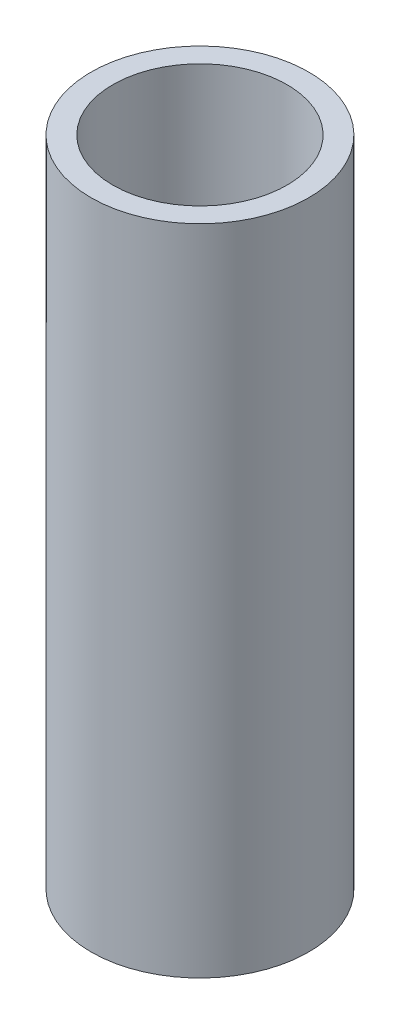
ISO-10303-21;
HEADER;
FILE_DESCRIPTION(('STEP AP214'),'2;1');
FILE_NAME('part.step','',(''),(''),'','','');
FILE_SCHEMA(('AUTOMOTIVE_DESIGN { 1 0 10303 214 1 1 1 1 }'));
ENDSEC;
DATA;
#1=APPLICATION_CONTEXT('core data for automotive mechanical design processes');
#2=APPLICATION_PROTOCOL_DEFINITION('international standard','automotive_design',2000,#1);
#3=PRODUCT_CONTEXT('',#1,'mechanical');
#4=PRODUCT('Part','Part','',(#3));
#5=PRODUCT_RELATED_PRODUCT_CATEGORY('part','',(#4));
#6=PRODUCT_DEFINITION_FORMATION('','',#4);
#7=PRODUCT_DEFINITION_CONTEXT('part definition',#1,'design');
#8=PRODUCT_DEFINITION('design','',#6,#7);
#9=PRODUCT_DEFINITION_SHAPE('','',#8);
#10=(LENGTH_UNIT() NAMED_UNIT(*) SI_UNIT(.MILLI.,.METRE.));
#11=(NAMED_UNIT(*) PLANE_ANGLE_UNIT() SI_UNIT($,.RADIAN.));
#12=(NAMED_UNIT(*) SI_UNIT($,.STERADIAN.) SOLID_ANGLE_UNIT());
#13=UNCERTAINTY_MEASURE_WITH_UNIT(LENGTH_MEASURE(1.E-05),#10,'distance_accuracy_value','');
#14=(GEOMETRIC_REPRESENTATION_CONTEXT(3) GLOBAL_UNCERTAINTY_ASSIGNED_CONTEXT((#13)) GLOBAL_UNIT_ASSIGNED_CONTEXT((#10,
#11,#12)) REPRESENTATION_CONTEXT('',''));
#15=CARTESIAN_POINT('',(0.,0.,0.));
#16=DIRECTION('',(0.,0.,1.));
#17=DIRECTION('',(1.,0.,0.));
#18=AXIS2_PLACEMENT_3D('',#15,#16,#17);
#19=CARTESIAN_POINT('',(0.,15.,0.));
#20=DIRECTION('',(0.,-1.,0.));
#21=DIRECTION('',(0.,0.,-1.));
#22=AXIS2_PLACEMENT_3D('',#19,#20,#21);
#23=CYLINDRICAL_SURFACE('',#22,5.);
#24=CARTESIAN_POINT('',(0.,15.,0.));
#25=DIRECTION('',(0.,1.,0.));
#26=DIRECTION('',(0.,0.,1.));
#27=AXIS2_PLACEMENT_3D('',#24,#25,#26);
#28=CIRCLE('',#27,5.);
#29=CARTESIAN_POINT('',(0.,15.,5.));
#30=VERTEX_POINT('',#29);
#31=EDGE_CURVE('E10',#30,#30,#28,.T.);
#32=ORIENTED_EDGE('',*,*,#31,.F.);
#33=EDGE_LOOP('',(#32));
#34=FACE_BOUND('',#33,.T.);
#35=CARTESIAN_POINT('',(0.,-15.,0.));
#36=DIRECTION('',(0.,1.,0.));
#37=DIRECTION('',(0.,0.,1.));
#38=AXIS2_PLACEMENT_3D('',#35,#36,#37);
#39=CIRCLE('',#38,5.);
#40=CARTESIAN_POINT('',(0.,-15.,5.));
#41=VERTEX_POINT('',#40);
#42=EDGE_CURVE('E36',#41,#41,#39,.T.);
#43=ORIENTED_EDGE('',*,*,#42,.T.);
#44=EDGE_LOOP('',(#43));
#45=FACE_BOUND('',#44,.T.);
#46=ADVANCED_FACE('F33',(#34,#45),#23,.T.);
#47=CARTESIAN_POINT('',(0.,15.,0.));
#48=DIRECTION('',(0.,1.,0.));
#49=DIRECTION('',(0.,0.,1.));
#50=AXIS2_PLACEMENT_3D('',#47,#48,#49);
#51=PLANE('',#50);
#52=CARTESIAN_POINT('',(0.,15.,0.));
#53=DIRECTION('',(0.,1.,0.));
#54=DIRECTION('',(0.,0.,1.));
#55=AXIS2_PLACEMENT_3D('',#52,#53,#54);
#56=CIRCLE('',#55,4.);
#57=CARTESIAN_POINT('',(0.,15.,4.));
#58=VERTEX_POINT('',#57);
#59=EDGE_CURVE('E43',#58,#58,#56,.T.);
#60=ORIENTED_EDGE('',*,*,#59,.F.);
#61=EDGE_LOOP('',(#60));
#62=FACE_BOUND('',#61,.T.);
#63=ORIENTED_EDGE('',*,*,#31,.T.);
#64=EDGE_LOOP('',(#63));
#65=FACE_BOUND('',#64,.T.);
#66=ADVANCED_FACE('F61',(#62,#65),#51,.T.);
#67=CARTESIAN_POINT('',(0.,-15.,0.));
#68=DIRECTION('',(0.,1.,0.));
#69=DIRECTION('',(0.,0.,1.));
#70=AXIS2_PLACEMENT_3D('',#67,#68,#69);
#71=PLANE('',#70);
#72=CARTESIAN_POINT('',(0.,-15.,0.));
#73=DIRECTION('',(0.,1.,0.));
#74=DIRECTION('',(0.,0.,1.));
#75=AXIS2_PLACEMENT_3D('',#72,#73,#74);
#76=CIRCLE('',#75,4.);
#77=CARTESIAN_POINT('',(0.,-15.,4.));
#78=VERTEX_POINT('',#77);
#79=EDGE_CURVE('E47',#78,#78,#76,.T.);
#80=ORIENTED_EDGE('',*,*,#79,.T.);
#81=EDGE_LOOP('',(#80));
#82=FACE_BOUND('',#81,.T.);
#83=ORIENTED_EDGE('',*,*,#42,.F.);
#84=EDGE_LOOP('',(#83));
#85=FACE_BOUND('',#84,.T.);
#86=ADVANCED_FACE('F51',(#82,#85),#71,.F.);
#87=CARTESIAN_POINT('',(0.,15.,0.));
#88=DIRECTION('',(0.,-1.,0.));
#89=DIRECTION('',(0.,0.,-1.));
#90=AXIS2_PLACEMENT_3D('',#87,#88,#89);
#91=CYLINDRICAL_SURFACE('',#90,4.);
#92=ORIENTED_EDGE('',*,*,#59,.T.);
#93=EDGE_LOOP('',(#92));
#94=FACE_BOUND('',#93,.T.);
#95=ORIENTED_EDGE('',*,*,#79,.F.);
#96=EDGE_LOOP('',(#95));
#97=FACE_BOUND('',#96,.T.);
#98=ADVANCED_FACE('F54',(#94,#97),#91,.F.);
#99=CLOSED_SHELL('',(#46,#66,#86,#98));
#100=MANIFOLD_SOLID_BREP('B2',#99);
#101=ADVANCED_BREP_SHAPE_REPRESENTATION('',(#18,#100),#14);
#102=SHAPE_DEFINITION_REPRESENTATION(#9,#101);
ENDSEC;
END-ISO-10303-21;
